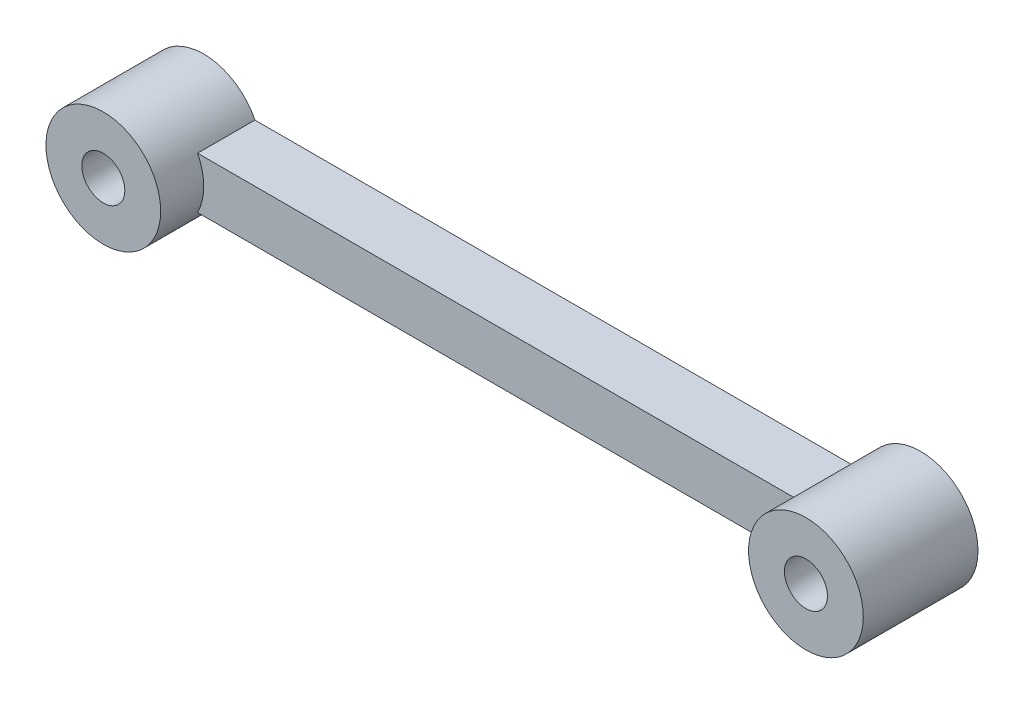
ISO-10303-21;
HEADER;
FILE_DESCRIPTION(('STEP AP214'),'2;1');
FILE_NAME('part.step','',(''),(''),'','','');
FILE_SCHEMA(('AUTOMOTIVE_DESIGN { 1 0 10303 214 1 1 1 1 }'));
ENDSEC;
DATA;
#1=APPLICATION_CONTEXT('core data for automotive mechanical design processes');
#2=APPLICATION_PROTOCOL_DEFINITION('international standard','automotive_design',2000,#1);
#3=PRODUCT_CONTEXT('',#1,'mechanical');
#4=PRODUCT('Part','Part','',(#3));
#5=PRODUCT_RELATED_PRODUCT_CATEGORY('part','',(#4));
#6=PRODUCT_DEFINITION_FORMATION('','',#4);
#7=PRODUCT_DEFINITION_CONTEXT('part definition',#1,'design');
#8=PRODUCT_DEFINITION('design','',#6,#7);
#9=PRODUCT_DEFINITION_SHAPE('','',#8);
#10=(LENGTH_UNIT() NAMED_UNIT(*) SI_UNIT(.MILLI.,.METRE.));
#11=(NAMED_UNIT(*) PLANE_ANGLE_UNIT() SI_UNIT($,.RADIAN.));
#12=(NAMED_UNIT(*) SI_UNIT($,.STERADIAN.) SOLID_ANGLE_UNIT());
#13=UNCERTAINTY_MEASURE_WITH_UNIT(LENGTH_MEASURE(1.E-05),#10,'distance_accuracy_value','');
#14=(GEOMETRIC_REPRESENTATION_CONTEXT(3) GLOBAL_UNCERTAINTY_ASSIGNED_CONTEXT((#13)) GLOBAL_UNIT_ASSIGNED_CONTEXT((#10,
#11,#12)) REPRESENTATION_CONTEXT('',''));
#15=CARTESIAN_POINT('',(0.,0.,0.));
#16=DIRECTION('',(0.,0.,1.));
#17=DIRECTION('',(1.,0.,0.));
#18=AXIS2_PLACEMENT_3D('',#15,#16,#17);
#19=CARTESIAN_POINT('',(0.,-10.,7.));
#20=DIRECTION('',(0.,0.,-1.));
#21=DIRECTION('',(-1.,0.,0.));
#22=AXIS2_PLACEMENT_3D('',#19,#20,#21);
#23=CYLINDRICAL_SURFACE('',#22,1.5);
#24=CARTESIAN_POINT('',(0.,-10.,7.));
#25=DIRECTION('',(0.,0.,1.));
#26=DIRECTION('',(1.,0.,0.));
#27=AXIS2_PLACEMENT_3D('',#24,#25,#26);
#28=CIRCLE('',#27,1.5);
#29=CARTESIAN_POINT('',(1.49999999999999,-10.,7.));
#30=VERTEX_POINT('',#29);
#31=EDGE_CURVE('E189',#30,#30,#28,.T.);
#32=ORIENTED_EDGE('',*,*,#31,.T.);
#33=EDGE_LOOP('',(#32));
#34=FACE_BOUND('',#33,.T.);
#35=DIRECTION('',(0.,0.,-1.));
#36=VECTOR('',#35,1.);
#37=CARTESIAN_POINT('',(0.,-8.50000000000003,7.));
#38=LINE('',#37,#36);
#39=CARTESIAN_POINT('',(0.,-8.50000000000003,0.));
#40=VERTEX_POINT('',#39);
#41=CARTESIAN_POINT('',(0.,-8.50000000000003,4.));
#42=VERTEX_POINT('',#41);
#43=EDGE_CURVE('E198',#40,#42,#38,.F.);
#44=ORIENTED_EDGE('',*,*,#43,.T.);
#45=CARTESIAN_POINT('',(0.,-10.,4.));
#46=DIRECTION('',(0.,0.,1.));
#47=DIRECTION('',(1.,0.,0.));
#48=AXIS2_PLACEMENT_3D('',#45,#46,#47);
#49=CIRCLE('',#48,1.5);
#50=CARTESIAN_POINT('',(0.,-11.5,4.));
#51=VERTEX_POINT('',#50);
#52=EDGE_CURVE('E203',#51,#42,#49,.T.);
#53=ORIENTED_EDGE('',*,*,#52,.F.);
#54=DIRECTION('',(0.,0.,-1.));
#55=VECTOR('',#54,1.);
#56=CARTESIAN_POINT('',(0.,-11.5,7.));
#57=LINE('',#56,#55);
#58=CARTESIAN_POINT('',(0.,-11.5,0.));
#59=VERTEX_POINT('',#58);
#60=EDGE_CURVE('E206',#51,#59,#57,.T.);
#61=ORIENTED_EDGE('',*,*,#60,.T.);
#62=CARTESIAN_POINT('',(0.,-10.,0.));
#63=DIRECTION('',(0.,0.,1.));
#64=DIRECTION('',(1.,0.,0.));
#65=AXIS2_PLACEMENT_3D('',#62,#63,#64);
#66=CIRCLE('',#65,1.5);
#67=EDGE_CURVE('E188',#40,#59,#66,.T.);
#68=ORIENTED_EDGE('',*,*,#67,.F.);
#69=EDGE_LOOP('',(#44,#53,#61,#68));
#70=FACE_BOUND('',#69,.T.);
#71=ADVANCED_FACE('F35',(#34,#70),#23,.F.);
#72=CARTESIAN_POINT('',(0.,-10.,7.));
#73=DIRECTION('',(0.,0.,1.));
#74=DIRECTION('',(1.,0.,0.));
#75=AXIS2_PLACEMENT_3D('',#72,#73,#74);
#76=PLANE('',#75);
#77=ORIENTED_EDGE('',*,*,#31,.F.);
#78=EDGE_LOOP('',(#77));
#79=FACE_BOUND('',#78,.T.);
#80=CARTESIAN_POINT('',(0.,-10.,7.));
#81=DIRECTION('',(0.,0.,1.));
#82=DIRECTION('',(1.,0.,0.));
#83=AXIS2_PLACEMENT_3D('',#80,#81,#82);
#84=CIRCLE('',#83,4.);
#85=CARTESIAN_POINT('',(3.99999999999999,-10.,7.));
#86=VERTEX_POINT('',#85);
#87=EDGE_CURVE('E195',#86,#86,#84,.T.);
#88=ORIENTED_EDGE('',*,*,#87,.T.);
#89=EDGE_LOOP('',(#88));
#90=FACE_BOUND('',#89,.T.);
#91=ADVANCED_FACE('F245',(#79,#90),#76,.T.);
#92=CARTESIAN_POINT('',(0.,-10.,0.));
#93=DIRECTION('',(0.,0.,1.));
#94=DIRECTION('',(1.,0.,0.));
#95=AXIS2_PLACEMENT_3D('',#92,#93,#94);
#96=PLANE('',#95);
#97=DIRECTION('',(1.,0.,0.));
#98=VECTOR('',#97,1.);
#99=CARTESIAN_POINT('',(0.,-10.5,0.));
#100=LINE('',#99,#98);
#101=CARTESIAN_POINT('',(38.,-10.5000000000001,0.));
#102=VERTEX_POINT('',#101);
#103=CARTESIAN_POINT('',(45.0313730334031,-10.5000000000001,0.));
#104=VERTEX_POINT('',#103);
#105=EDGE_CURVE('E139',#102,#104,#100,.T.);
#106=ORIENTED_EDGE('',*,*,#105,.T.);
#107=CARTESIAN_POINT('',(49.,-10.0000000000001,0.));
#108=DIRECTION('',(0.,0.,1.));
#109=DIRECTION('',(1.,0.,0.));
#110=AXIS2_PLACEMENT_3D('',#107,#108,#109);
#111=CIRCLE('',#110,4.00000000000001);
#112=CARTESIAN_POINT('',(45.4241870782095,-11.7926410539638,0.));
#113=VERTEX_POINT('',#112);
#114=EDGE_CURVE('E165',#104,#113,#111,.T.);
#115=ORIENTED_EDGE('',*,*,#114,.T.);
#116=DIRECTION('',(-1.,0.,0.));
#117=VECTOR('',#116,1.);
#118=CARTESIAN_POINT('',(49.,-11.7926410539638,0.));
#119=LINE('',#118,#117);
#120=CARTESIAN_POINT('',(3.5758129217905,-11.7926410539637,0.));
#121=VERTEX_POINT('',#120);
#122=EDGE_CURVE('E175',#113,#121,#119,.T.);
#123=ORIENTED_EDGE('',*,*,#122,.T.);
#124=CARTESIAN_POINT('',(0.,-10.,0.));
#125=DIRECTION('',(0.,0.,1.));
#126=DIRECTION('',(1.,0.,0.));
#127=AXIS2_PLACEMENT_3D('',#124,#125,#126);
#128=CIRCLE('',#127,4.);
#129=CARTESIAN_POINT('',(3.5758129217905,-8.20735894603635,0.));
#130=VERTEX_POINT('',#129);
#131=EDGE_CURVE('E192',#130,#121,#128,.T.);
#132=ORIENTED_EDGE('',*,*,#131,.F.);
#133=DIRECTION('',(-1.,0.,0.));
#134=VECTOR('',#133,1.);
#135=CARTESIAN_POINT('',(49.,-8.20735894603641,0.));
#136=LINE('',#135,#134);
#137=CARTESIAN_POINT('',(45.4241870782095,-8.20735894603641,0.));
#138=VERTEX_POINT('',#137);
#139=EDGE_CURVE('E178',#138,#130,#136,.T.);
#140=ORIENTED_EDGE('',*,*,#139,.F.);
#141=CARTESIAN_POINT('',(45.0313730334031,-9.50000000000009,0.));
#142=VERTEX_POINT('',#141);
#143=EDGE_CURVE('E166',#138,#142,#111,.T.);
#144=ORIENTED_EDGE('',*,*,#143,.T.);
#145=DIRECTION('',(1.,0.,0.));
#146=VECTOR('',#145,1.);
#147=CARTESIAN_POINT('',(0.,-9.50000000000003,0.));
#148=LINE('',#147,#146);
#149=CARTESIAN_POINT('',(38.,-9.50000000000008,0.));
#150=VERTEX_POINT('',#149);
#151=EDGE_CURVE('E50',#150,#142,#148,.T.);
#152=ORIENTED_EDGE('',*,*,#151,.F.);
#153=DIRECTION('',(0.,1.,0.));
#154=VECTOR('',#153,1.);
#155=CARTESIAN_POINT('',(38.,-10.0000000000001,0.));
#156=LINE('',#155,#154);
#157=EDGE_CURVE('E132',#150,#102,#156,.F.);
#158=ORIENTED_EDGE('',*,*,#157,.T.);
#159=EDGE_LOOP('',(#106,#115,#123,#132,#140,#144,#152,#158));
#160=FACE_BOUND('',#159,.T.);
#161=ORIENTED_EDGE('',*,*,#67,.T.);
#162=DIRECTION('',(0.,-1.,0.));
#163=VECTOR('',#162,1.);
#164=CARTESIAN_POINT('',(0.,-8.20735894603635,0.));
#165=LINE('',#164,#163);
#166=EDGE_CURVE('E168',#40,#59,#165,.T.);
#167=ORIENTED_EDGE('',*,*,#166,.F.);
#168=EDGE_LOOP('',(#161,#167));
#169=FACE_BOUND('',#168,.T.);
#170=ADVANCED_FACE('F232',(#160,#169),#96,.F.);
#171=CARTESIAN_POINT('',(0.,-10.,7.));
#172=DIRECTION('',(0.,0.,-1.));
#173=DIRECTION('',(-1.,0.,0.));
#174=AXIS2_PLACEMENT_3D('',#171,#172,#173);
#175=CYLINDRICAL_SURFACE('',#174,4.);
#176=ORIENTED_EDGE('',*,*,#87,.F.);
#177=EDGE_LOOP('',(#176));
#178=FACE_BOUND('',#177,.T.);
#179=CARTESIAN_POINT('',(0.,-10.,4.));
#180=DIRECTION('',(0.,0.,1.));
#181=DIRECTION('',(1.,0.,0.));
#182=AXIS2_PLACEMENT_3D('',#179,#180,#181);
#183=CIRCLE('',#182,4.);
#184=CARTESIAN_POINT('',(3.57581292179049,-11.7926410539637,4.));
#185=VERTEX_POINT('',#184);
#186=CARTESIAN_POINT('',(3.5758129217905,-8.20735894603635,4.));
#187=VERTEX_POINT('',#186);
#188=EDGE_CURVE('E180',#185,#187,#183,.T.);
#189=ORIENTED_EDGE('',*,*,#188,.T.);
#190=DIRECTION('',(0.,0.,-1.));
#191=VECTOR('',#190,1.);
#192=CARTESIAN_POINT('',(3.5758129217905,-8.20735894603635,7.));
#193=LINE('',#192,#191);
#194=EDGE_CURVE('E212',#187,#130,#193,.T.);
#195=ORIENTED_EDGE('',*,*,#194,.T.);
#196=ORIENTED_EDGE('',*,*,#131,.T.);
#197=DIRECTION('',(0.,0.,-1.));
#198=VECTOR('',#197,1.);
#199=CARTESIAN_POINT('',(3.57581292179049,-11.7926410539637,7.));
#200=LINE('',#199,#198);
#201=EDGE_CURVE('E209',#121,#185,#200,.F.);
#202=ORIENTED_EDGE('',*,*,#201,.T.);
#203=EDGE_LOOP('',(#189,#195,#196,#202));
#204=FACE_BOUND('',#203,.T.);
#205=ADVANCED_FACE('F37',(#178,#204),#175,.T.);
#206=CARTESIAN_POINT('',(0.,0.,0.));
#207=DIRECTION('',(1.,0.,0.));
#208=DIRECTION('',(0.,1.,0.));
#209=AXIS2_PLACEMENT_3D('',#206,#207,#208);
#210=PLANE('',#209);
#211=DIRECTION('',(0.,1.,0.));
#212=VECTOR('',#211,1.);
#213=CARTESIAN_POINT('',(0.,-8.20735894603635,4.));
#214=LINE('',#213,#212);
#215=EDGE_CURVE('E173',#51,#42,#214,.T.);
#216=ORIENTED_EDGE('',*,*,#215,.T.);
#217=ORIENTED_EDGE('',*,*,#43,.F.);
#218=ORIENTED_EDGE('',*,*,#166,.T.);
#219=ORIENTED_EDGE('',*,*,#60,.F.);
#220=EDGE_LOOP('',(#216,#217,#218,#219));
#221=FACE_BOUND('',#220,.T.);
#222=ADVANCED_FACE('F262',(#221),#210,.F.);
#223=CARTESIAN_POINT('',(49.,-8.20735894603641,4.));
#224=DIRECTION('',(0.,0.,1.));
#225=DIRECTION('',(1.,0.,0.));
#226=AXIS2_PLACEMENT_3D('',#223,#224,#225);
#227=PLANE('',#226);
#228=ORIENTED_EDGE('',*,*,#52,.T.);
#229=ORIENTED_EDGE('',*,*,#215,.F.);
#230=EDGE_LOOP('',(#228,#229));
#231=FACE_BOUND('',#230,.T.);
#232=ADVANCED_FACE('F242',(#231),#227,.T.);
#233=CARTESIAN_POINT('',(49.,-8.20735894603641,4.));
#234=DIRECTION('',(0.,1.,0.));
#235=DIRECTION('',(-1.,0.,0.));
#236=AXIS2_PLACEMENT_3D('',#233,#234,#235);
#237=PLANE('',#236);
#238=DIRECTION('',(0.,0.,1.));
#239=VECTOR('',#238,1.);
#240=CARTESIAN_POINT('',(45.4241870782095,-8.20735894603641,-1.));
#241=LINE('',#240,#239);
#242=CARTESIAN_POINT('',(45.4241870782095,-8.20735894603641,4.));
#243=VERTEX_POINT('',#242);
#244=EDGE_CURVE('E58',#138,#243,#241,.T.);
#245=ORIENTED_EDGE('',*,*,#244,.F.);
#246=ORIENTED_EDGE('',*,*,#139,.T.);
#247=ORIENTED_EDGE('',*,*,#194,.F.);
#248=DIRECTION('',(-1.,0.,0.));
#249=VECTOR('',#248,1.);
#250=CARTESIAN_POINT('',(49.,-8.20735894603641,4.));
#251=LINE('',#250,#249);
#252=EDGE_CURVE('E181',#243,#187,#251,.T.);
#253=ORIENTED_EDGE('',*,*,#252,.F.);
#254=EDGE_LOOP('',(#245,#246,#247,#253));
#255=FACE_BOUND('',#254,.T.);
#256=ADVANCED_FACE('F258',(#255),#237,.T.);
#257=CARTESIAN_POINT('',(49.,-11.7926410539638,4.));
#258=DIRECTION('',(0.,-1.,0.));
#259=DIRECTION('',(1.,0.,0.));
#260=AXIS2_PLACEMENT_3D('',#257,#258,#259);
#261=PLANE('',#260);
#262=DIRECTION('',(0.,0.,1.));
#263=VECTOR('',#262,1.);
#264=CARTESIAN_POINT('',(45.4241870782095,-11.7926410539638,-1.));
#265=LINE('',#264,#263);
#266=CARTESIAN_POINT('',(45.4241870782095,-11.7926410539638,4.));
#267=VERTEX_POINT('',#266);
#268=EDGE_CURVE('E161',#267,#113,#265,.F.);
#269=ORIENTED_EDGE('',*,*,#268,.F.);
#270=DIRECTION('',(-1.,0.,0.));
#271=VECTOR('',#270,1.);
#272=CARTESIAN_POINT('',(49.,-11.7926410539638,4.));
#273=LINE('',#272,#271);
#274=EDGE_CURVE('E184',#267,#185,#273,.T.);
#275=ORIENTED_EDGE('',*,*,#274,.T.);
#276=ORIENTED_EDGE('',*,*,#201,.F.);
#277=ORIENTED_EDGE('',*,*,#122,.F.);
#278=EDGE_LOOP('',(#269,#275,#276,#277));
#279=FACE_BOUND('',#278,.T.);
#280=ADVANCED_FACE('F256',(#279),#261,.T.);
#281=ORIENTED_EDGE('',*,*,#252,.T.);
#282=ORIENTED_EDGE('',*,*,#188,.F.);
#283=ORIENTED_EDGE('',*,*,#274,.F.);
#284=CARTESIAN_POINT('',(49.,-10.0000000000001,4.));
#285=DIRECTION('',(0.,0.,1.));
#286=DIRECTION('',(1.,0.,0.));
#287=AXIS2_PLACEMENT_3D('',#284,#285,#286);
#288=CIRCLE('',#287,4.00000000000001);
#289=EDGE_CURVE('E11',#243,#267,#288,.T.);
#290=ORIENTED_EDGE('',*,*,#289,.F.);
#291=EDGE_LOOP('',(#281,#282,#283,#290));
#292=FACE_BOUND('',#291,.T.);
#293=ADVANCED_FACE('F241',(#292),#227,.T.);
#294=CARTESIAN_POINT('',(49.,-10.0000000000001,-1.));
#295=DIRECTION('',(0.,0.,1.));
#296=DIRECTION('',(1.,0.,0.));
#297=AXIS2_PLACEMENT_3D('',#294,#295,#296);
#298=CYLINDRICAL_SURFACE('',#297,4.00000000000001);
#299=CARTESIAN_POINT('',(49.,-10.0000000000001,-1.));
#300=DIRECTION('',(0.,0.,1.));
#301=DIRECTION('',(1.,0.,0.));
#302=AXIS2_PLACEMENT_3D('',#299,#300,#301);
#303=CIRCLE('',#302,4.00000000000001);
#304=CARTESIAN_POINT('',(53.,-10.0000000000001,-1.));
#305=VERTEX_POINT('',#304);
#306=EDGE_CURVE('E152',#305,#305,#303,.T.);
#307=ORIENTED_EDGE('',*,*,#306,.T.);
#308=EDGE_LOOP('',(#307));
#309=FACE_BOUND('',#308,.T.);
#310=CARTESIAN_POINT('',(49.,-10.0000000000001,7.));
#311=DIRECTION('',(0.,0.,1.));
#312=DIRECTION('',(1.,0.,0.));
#313=AXIS2_PLACEMENT_3D('',#310,#311,#312);
#314=CIRCLE('',#313,4.00000000000001);
#315=CARTESIAN_POINT('',(53.,-10.0000000000001,7.));
#316=VERTEX_POINT('',#315);
#317=EDGE_CURVE('E149',#316,#316,#314,.T.);
#318=ORIENTED_EDGE('',*,*,#317,.F.);
#319=EDGE_LOOP('',(#318));
#320=FACE_BOUND('',#319,.T.);
#321=ORIENTED_EDGE('',*,*,#289,.T.);
#322=ORIENTED_EDGE('',*,*,#268,.T.);
#323=ORIENTED_EDGE('',*,*,#114,.F.);
#324=DIRECTION('',(0.,0.,1.));
#325=VECTOR('',#324,1.);
#326=CARTESIAN_POINT('',(45.0313730334031,-10.5000000000001,-1.));
#327=LINE('',#326,#325);
#328=CARTESIAN_POINT('',(45.0313730334031,-10.5000000000001,-0.715411829803306));
#329=VERTEX_POINT('',#328);
#330=EDGE_CURVE('E138',#329,#104,#327,.T.);
#331=ORIENTED_EDGE('',*,*,#330,.F.);
#332=CARTESIAN_POINT('',(49.,-10.0000000000001,-1.11920247872663));
#333=DIRECTION('',(0.101223088902299,0.,0.994863752617954));
#334=DIRECTION('',(-0.994863752617954,0.,0.101223088902299));
#335=AXIS2_PLACEMENT_3D('',#332,#333,#334);
#336=ELLIPSE('',#335,4.02065105847321,4.00000000000001);
#337=CARTESIAN_POINT('',(45.0313730334031,-9.50000000000009,-0.715411829803306));
#338=VERTEX_POINT('',#337);
#339=EDGE_CURVE('E129',#338,#329,#336,.T.);
#340=ORIENTED_EDGE('',*,*,#339,.F.);
#341=DIRECTION('',(0.,0.,1.));
#342=VECTOR('',#341,1.);
#343=CARTESIAN_POINT('',(45.0313730334031,-9.50000000000009,-1.));
#344=LINE('',#343,#342);
#345=EDGE_CURVE('E116',#338,#142,#344,.T.);
#346=ORIENTED_EDGE('',*,*,#345,.T.);
#347=ORIENTED_EDGE('',*,*,#143,.F.);
#348=ORIENTED_EDGE('',*,*,#244,.T.);
#349=EDGE_LOOP('',(#321,#322,#323,#331,#340,#346,#347,#348));
#350=FACE_BOUND('',#349,.T.);
#351=ADVANCED_FACE('F135',(#309,#320,#350),#298,.T.);
#352=CARTESIAN_POINT('',(49.,-10.0000000000001,-1.));
#353=DIRECTION('',(0.,0.,1.));
#354=DIRECTION('',(1.,0.,0.));
#355=AXIS2_PLACEMENT_3D('',#352,#353,#354);
#356=PLANE('',#355);
#357=ORIENTED_EDGE('',*,*,#306,.F.);
#358=EDGE_LOOP('',(#357));
#359=FACE_BOUND('',#358,.T.);
#360=CARTESIAN_POINT('',(49.,-10.0000000000001,-1.));
#361=DIRECTION('',(0.,0.,1.));
#362=DIRECTION('',(1.,0.,0.));
#363=AXIS2_PLACEMENT_3D('',#360,#361,#362);
#364=CIRCLE('',#363,1.5);
#365=CARTESIAN_POINT('',(50.5,-10.0000000000001,-1.));
#366=VERTEX_POINT('',#365);
#367=EDGE_CURVE('E146',#366,#366,#364,.T.);
#368=ORIENTED_EDGE('',*,*,#367,.T.);
#369=EDGE_LOOP('',(#368));
#370=FACE_BOUND('',#369,.T.);
#371=ADVANCED_FACE('F273',(#359,#370),#356,.F.);
#372=CARTESIAN_POINT('',(49.,-10.0000000000001,7.));
#373=DIRECTION('',(0.,0.,1.));
#374=DIRECTION('',(1.,0.,0.));
#375=AXIS2_PLACEMENT_3D('',#372,#373,#374);
#376=PLANE('',#375);
#377=CARTESIAN_POINT('',(49.,-10.0000000000001,7.));
#378=DIRECTION('',(0.,0.,1.));
#379=DIRECTION('',(1.,0.,0.));
#380=AXIS2_PLACEMENT_3D('',#377,#378,#379);
#381=CIRCLE('',#380,1.5);
#382=CARTESIAN_POINT('',(50.5,-10.0000000000001,7.));
#383=VERTEX_POINT('',#382);
#384=EDGE_CURVE('E141',#383,#383,#381,.T.);
#385=ORIENTED_EDGE('',*,*,#384,.F.);
#386=EDGE_LOOP('',(#385));
#387=FACE_BOUND('',#386,.T.);
#388=ORIENTED_EDGE('',*,*,#317,.T.);
#389=EDGE_LOOP('',(#388));
#390=FACE_BOUND('',#389,.T.);
#391=ADVANCED_FACE('F275',(#387,#390),#376,.T.);
#392=CARTESIAN_POINT('',(49.,-10.0000000000001,-1.));
#393=DIRECTION('',(0.,0.,1.));
#394=DIRECTION('',(1.,0.,0.));
#395=AXIS2_PLACEMENT_3D('',#392,#393,#394);
#396=CYLINDRICAL_SURFACE('',#395,1.5);
#397=ORIENTED_EDGE('',*,*,#367,.F.);
#398=EDGE_LOOP('',(#397));
#399=FACE_BOUND('',#398,.T.);
#400=CARTESIAN_POINT('',(49.,-10.0000000000001,0.));
#401=DIRECTION('',(0.,0.,1.));
#402=DIRECTION('',(1.,0.,0.));
#403=AXIS2_PLACEMENT_3D('',#400,#401,#402);
#404=CIRCLE('',#403,1.5);
#405=CARTESIAN_POINT('',(49.,-8.50000000000009,0.));
#406=VERTEX_POINT('',#405);
#407=CARTESIAN_POINT('',(49.,-11.5000000000001,0.));
#408=VERTEX_POINT('',#407);
#409=EDGE_CURVE('E159',#406,#408,#404,.T.);
#410=ORIENTED_EDGE('',*,*,#409,.T.);
#411=DIRECTION('',(0.,0.,1.));
#412=VECTOR('',#411,1.);
#413=CARTESIAN_POINT('',(49.,-11.5000000000001,-1.));
#414=LINE('',#413,#412);
#415=CARTESIAN_POINT('',(49.,-11.5000000000001,4.));
#416=VERTEX_POINT('',#415);
#417=EDGE_CURVE('E215',#416,#408,#414,.F.);
#418=ORIENTED_EDGE('',*,*,#417,.F.);
#419=CARTESIAN_POINT('',(49.,-10.0000000000001,4.));
#420=DIRECTION('',(0.,0.,1.));
#421=DIRECTION('',(1.,0.,0.));
#422=AXIS2_PLACEMENT_3D('',#419,#420,#421);
#423=CIRCLE('',#422,1.5);
#424=CARTESIAN_POINT('',(49.,-8.50000000000009,4.));
#425=VERTEX_POINT('',#424);
#426=EDGE_CURVE('E155',#425,#416,#423,.T.);
#427=ORIENTED_EDGE('',*,*,#426,.F.);
#428=DIRECTION('',(0.,0.,1.));
#429=VECTOR('',#428,1.);
#430=CARTESIAN_POINT('',(49.,-8.50000000000009,-1.));
#431=LINE('',#430,#429);
#432=EDGE_CURVE('E43',#406,#425,#431,.T.);
#433=ORIENTED_EDGE('',*,*,#432,.F.);
#434=EDGE_LOOP('',(#410,#418,#427,#433));
#435=FACE_BOUND('',#434,.T.);
#436=ORIENTED_EDGE('',*,*,#384,.T.);
#437=EDGE_LOOP('',(#436));
#438=FACE_BOUND('',#437,.T.);
#439=ADVANCED_FACE('F225',(#399,#435,#438),#396,.F.);
#440=CARTESIAN_POINT('',(49.,0.,0.));
#441=DIRECTION('',(1.,0.,0.));
#442=DIRECTION('',(0.,1.,0.));
#443=AXIS2_PLACEMENT_3D('',#440,#441,#442);
#444=PLANE('',#443);
#445=ORIENTED_EDGE('',*,*,#417,.T.);
#446=DIRECTION('',(0.,-1.,0.));
#447=VECTOR('',#446,1.);
#448=CARTESIAN_POINT('',(49.,-8.20735894603641,0.));
#449=LINE('',#448,#447);
#450=EDGE_CURVE('E169',#406,#408,#449,.T.);
#451=ORIENTED_EDGE('',*,*,#450,.F.);
#452=ORIENTED_EDGE('',*,*,#432,.T.);
#453=DIRECTION('',(0.,1.,0.));
#454=VECTOR('',#453,1.);
#455=CARTESIAN_POINT('',(49.,-8.20735894603641,4.));
#456=LINE('',#455,#454);
#457=EDGE_CURVE('E172',#416,#425,#456,.T.);
#458=ORIENTED_EDGE('',*,*,#457,.F.);
#459=EDGE_LOOP('',(#445,#451,#452,#458));
#460=FACE_BOUND('',#459,.T.);
#461=ADVANCED_FACE('F221',(#460),#444,.T.);
#462=ORIENTED_EDGE('',*,*,#457,.T.);
#463=ORIENTED_EDGE('',*,*,#426,.T.);
#464=EDGE_LOOP('',(#462,#463));
#465=FACE_BOUND('',#464,.T.);
#466=ADVANCED_FACE('F231',(#465),#227,.T.);
#467=ORIENTED_EDGE('',*,*,#450,.T.);
#468=ORIENTED_EDGE('',*,*,#409,.F.);
#469=EDGE_LOOP('',(#467,#468));
#470=FACE_BOUND('',#469,.T.);
#471=ADVANCED_FACE('F229',(#470),#96,.F.);
#472=CARTESIAN_POINT('',(47.8284271247462,-10.0000000000001,-1.));
#473=DIRECTION('',(0.101223088902299,0.,0.994863752617954));
#474=DIRECTION('',(-0.994863752617954,0.,0.101223088902299));
#475=AXIS2_PLACEMENT_3D('',#472,#473,#474);
#476=PLANE('',#475);
#477=ORIENTED_EDGE('',*,*,#157,.F.);
#478=DIRECTION('',(-0.994863752617954,0.,0.101223088902299));
#479=VECTOR('',#478,1.);
#480=CARTESIAN_POINT('',(47.8284271247462,-9.5000000000001,-1.));
#481=LINE('',#480,#479);
#482=EDGE_CURVE('E119',#338,#150,#481,.T.);
#483=ORIENTED_EDGE('',*,*,#482,.F.);
#484=ORIENTED_EDGE('',*,*,#339,.T.);
#485=DIRECTION('',(-0.994863752617954,0.,0.101223088902299));
#486=VECTOR('',#485,1.);
#487=CARTESIAN_POINT('',(47.8284271247462,-10.5000000000001,-1.));
#488=LINE('',#487,#486);
#489=EDGE_CURVE('E124',#329,#102,#488,.T.);
#490=ORIENTED_EDGE('',*,*,#489,.T.);
#491=EDGE_LOOP('',(#477,#483,#484,#490));
#492=FACE_BOUND('',#491,.T.);
#493=ADVANCED_FACE('F127',(#492),#476,.F.);
#494=CARTESIAN_POINT('',(24.5,-10.5000000000001,3.));
#495=DIRECTION('',(0.,-1.,0.));
#496=DIRECTION('',(1.,0.,0.));
#497=AXIS2_PLACEMENT_3D('',#494,#495,#496);
#498=PLANE('',#497);
#499=ORIENTED_EDGE('',*,*,#330,.T.);
#500=ORIENTED_EDGE('',*,*,#105,.F.);
#501=ORIENTED_EDGE('',*,*,#489,.F.);
#502=EDGE_LOOP('',(#499,#500,#501));
#503=FACE_BOUND('',#502,.T.);
#504=ADVANCED_FACE('F237',(#503),#498,.T.);
#505=CARTESIAN_POINT('',(24.5,-9.50000000000006,3.));
#506=DIRECTION('',(0.,-1.,0.));
#507=DIRECTION('',(1.,0.,0.));
#508=AXIS2_PLACEMENT_3D('',#505,#506,#507);
#509=PLANE('',#508);
#510=ORIENTED_EDGE('',*,*,#482,.T.);
#511=ORIENTED_EDGE('',*,*,#151,.T.);
#512=ORIENTED_EDGE('',*,*,#345,.F.);
#513=EDGE_LOOP('',(#510,#511,#512));
#514=FACE_BOUND('',#513,.T.);
#515=ADVANCED_FACE('F118',(#514),#509,.F.);
#516=CLOSED_SHELL('',(#71,#91,#170,#205,#222,#232,#256,#280,#293,#351,#371,#391,#439,#461,#466,
#471,#493,#504,#515));
#517=MANIFOLD_SOLID_BREP('B2',#516);
#518=ADVANCED_BREP_SHAPE_REPRESENTATION('',(#18,#517),#14);
#519=SHAPE_DEFINITION_REPRESENTATION(#9,#518);
ENDSEC;
END-ISO-10303-21;
